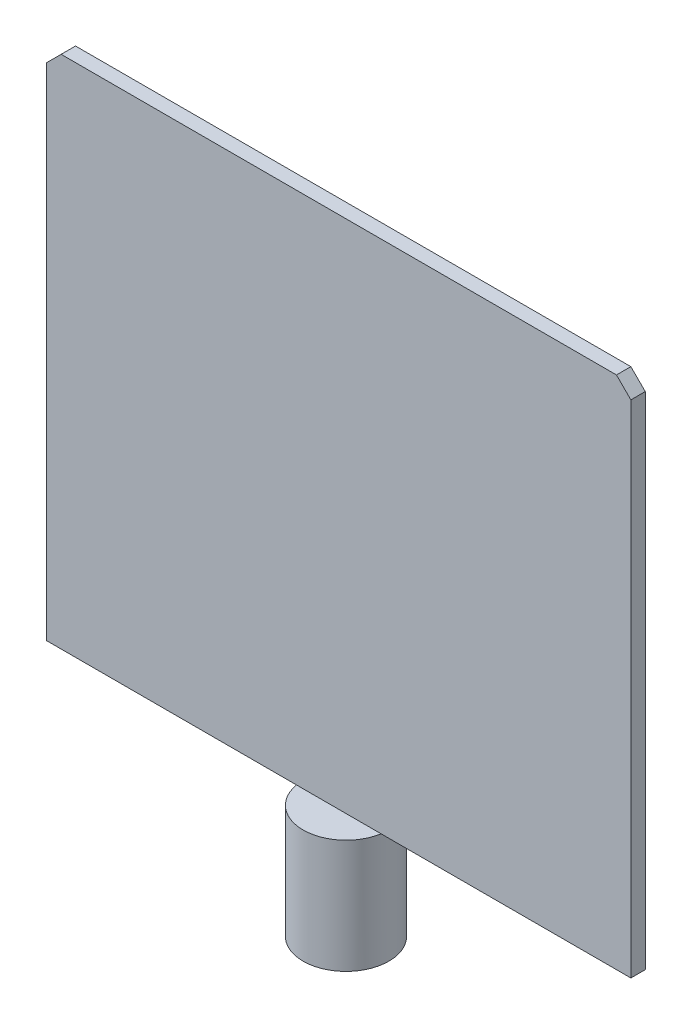
ISO-10303-21;
HEADER;
FILE_DESCRIPTION(('STEP AP214'),'2;1');
FILE_NAME('part.step','',(''),(''),'','','');
FILE_SCHEMA(('AUTOMOTIVE_DESIGN { 1 0 10303 214 1 1 1 1 }'));
ENDSEC;
DATA;
#1=APPLICATION_CONTEXT('core data for automotive mechanical design processes');
#2=APPLICATION_PROTOCOL_DEFINITION('international standard','automotive_design',2000,#1);
#3=PRODUCT_CONTEXT('',#1,'mechanical');
#4=PRODUCT('Part','Part','',(#3));
#5=PRODUCT_RELATED_PRODUCT_CATEGORY('part','',(#4));
#6=PRODUCT_DEFINITION_FORMATION('','',#4);
#7=PRODUCT_DEFINITION_CONTEXT('part definition',#1,'design');
#8=PRODUCT_DEFINITION('design','',#6,#7);
#9=PRODUCT_DEFINITION_SHAPE('','',#8);
#10=(LENGTH_UNIT() NAMED_UNIT(*) SI_UNIT(.MILLI.,.METRE.));
#11=(NAMED_UNIT(*) PLANE_ANGLE_UNIT() SI_UNIT($,.RADIAN.));
#12=(NAMED_UNIT(*) SI_UNIT($,.STERADIAN.) SOLID_ANGLE_UNIT());
#13=UNCERTAINTY_MEASURE_WITH_UNIT(LENGTH_MEASURE(1.E-05),#10,'distance_accuracy_value','');
#14=(GEOMETRIC_REPRESENTATION_CONTEXT(3) GLOBAL_UNCERTAINTY_ASSIGNED_CONTEXT((#13)) GLOBAL_UNIT_ASSIGNED_CONTEXT((#10,
#11,#12)) REPRESENTATION_CONTEXT('',''));
#15=CARTESIAN_POINT('',(0.,0.,0.));
#16=DIRECTION('',(0.,0.,1.));
#17=DIRECTION('',(1.,0.,0.));
#18=AXIS2_PLACEMENT_3D('',#15,#16,#17);
#19=CARTESIAN_POINT('',(0.,0.,0.));
#20=DIRECTION('',(0.,1.,0.));
#21=DIRECTION('',(0.,0.,1.));
#22=AXIS2_PLACEMENT_3D('',#19,#20,#21);
#23=PLANE('',#22);
#24=CARTESIAN_POINT('',(0.,0.,0.));
#25=DIRECTION('',(0.,1.,0.));
#26=DIRECTION('',(0.,0.,1.));
#27=AXIS2_PLACEMENT_3D('',#24,#25,#26);
#28=CIRCLE('',#27,2.98);
#29=CARTESIAN_POINT('',(2.93775424431657,0.,-0.5));
#30=VERTEX_POINT('',#29);
#31=CARTESIAN_POINT('',(-2.93775424431657,0.,-0.5));
#32=VERTEX_POINT('',#31);
#33=EDGE_CURVE('E200',#30,#32,#28,.T.);
#34=ORIENTED_EDGE('',*,*,#33,.T.);
#35=DIRECTION('',(1.,0.,0.));
#36=VECTOR('',#35,1.);
#37=CARTESIAN_POINT('',(-20.3,0.,-0.5));
#38=LINE('',#37,#36);
#39=EDGE_CURVE('E147',#32,#30,#38,.T.);
#40=ORIENTED_EDGE('',*,*,#39,.T.);
#41=EDGE_LOOP('',(#34,#40));
#42=FACE_BOUND('',#41,.T.);
#43=ADVANCED_FACE('F41',(#42),#23,.T.);
#44=CARTESIAN_POINT('',(0.,-7.9,0.));
#45=DIRECTION('',(0.,1.,0.));
#46=DIRECTION('',(0.,0.,1.));
#47=AXIS2_PLACEMENT_3D('',#44,#45,#46);
#48=CYLINDRICAL_SURFACE('',#47,2.98);
#49=CARTESIAN_POINT('',(0.,-7.9,0.));
#50=DIRECTION('',(0.,1.,0.));
#51=DIRECTION('',(0.,0.,1.));
#52=AXIS2_PLACEMENT_3D('',#49,#50,#51);
#53=CIRCLE('',#52,2.98);
#54=CARTESIAN_POINT('',(0.,-7.9,2.98));
#55=VERTEX_POINT('',#54);
#56=EDGE_CURVE('E154',#55,#55,#53,.T.);
#57=ORIENTED_EDGE('',*,*,#56,.T.);
#58=EDGE_LOOP('',(#57));
#59=FACE_BOUND('',#58,.T.);
#60=CARTESIAN_POINT('',(2.93775424431657,0.,0.5));
#61=VERTEX_POINT('',#60);
#62=EDGE_CURVE('E163',#61,#30,#28,.T.);
#63=ORIENTED_EDGE('',*,*,#62,.F.);
#64=CARTESIAN_POINT('',(-2.93775424431657,0.,0.5));
#65=VERTEX_POINT('',#64);
#66=EDGE_CURVE('E201',#65,#61,#28,.T.);
#67=ORIENTED_EDGE('',*,*,#66,.F.);
#68=EDGE_CURVE('E135',#32,#65,#28,.T.);
#69=ORIENTED_EDGE('',*,*,#68,.F.);
#70=ORIENTED_EDGE('',*,*,#33,.F.);
#71=EDGE_LOOP('',(#63,#67,#69,#70));
#72=FACE_BOUND('',#71,.T.);
#73=ADVANCED_FACE('F215',(#59,#72),#48,.T.);
#74=CARTESIAN_POINT('',(0.,-7.9,0.));
#75=DIRECTION('',(0.,1.,0.));
#76=DIRECTION('',(0.,0.,1.));
#77=AXIS2_PLACEMENT_3D('',#74,#75,#76);
#78=PLANE('',#77);
#79=ORIENTED_EDGE('',*,*,#56,.F.);
#80=EDGE_LOOP('',(#79));
#81=FACE_BOUND('',#80,.T.);
#82=ADVANCED_FACE('F222',(#81),#78,.F.);
#83=DIRECTION('',(1.,0.,0.));
#84=VECTOR('',#83,1.);
#85=CARTESIAN_POINT('',(-20.3,0.,0.5));
#86=LINE('',#85,#84);
#87=EDGE_CURVE('E139',#65,#61,#86,.T.);
#88=ORIENTED_EDGE('',*,*,#87,.F.);
#89=ORIENTED_EDGE('',*,*,#66,.T.);
#90=EDGE_LOOP('',(#88,#89));
#91=FACE_BOUND('',#90,.T.);
#92=ADVANCED_FACE('F220',(#91),#23,.T.);
#93=CARTESIAN_POINT('',(-20.3,0.,-0.5));
#94=DIRECTION('',(0.,-1.,0.));
#95=DIRECTION('',(0.,0.,-1.));
#96=AXIS2_PLACEMENT_3D('',#93,#94,#95);
#97=PLANE('',#96);
#98=CARTESIAN_POINT('',(20.3,0.,0.5));
#99=VERTEX_POINT('',#98);
#100=EDGE_CURVE('E120',#61,#99,#86,.T.);
#101=ORIENTED_EDGE('',*,*,#100,.F.);
#102=ORIENTED_EDGE('',*,*,#62,.T.);
#103=CARTESIAN_POINT('',(20.3,0.,-0.5));
#104=VERTEX_POINT('',#103);
#105=EDGE_CURVE('E157',#30,#104,#38,.T.);
#106=ORIENTED_EDGE('',*,*,#105,.T.);
#107=DIRECTION('',(0.,0.,1.));
#108=VECTOR('',#107,1.);
#109=CARTESIAN_POINT('',(20.3,0.,-0.5));
#110=LINE('',#109,#108);
#111=EDGE_CURVE('E130',#104,#99,#110,.T.);
#112=ORIENTED_EDGE('',*,*,#111,.T.);
#113=EDGE_LOOP('',(#101,#102,#106,#112));
#114=FACE_BOUND('',#113,.T.);
#115=ADVANCED_FACE('F212',(#114),#97,.T.);
#116=CARTESIAN_POINT('',(-20.3,35.8,-0.5));
#117=DIRECTION('',(-1.,0.,0.));
#118=DIRECTION('',(0.,-1.,0.));
#119=AXIS2_PLACEMENT_3D('',#116,#117,#118);
#120=PLANE('',#119);
#121=DIRECTION('',(0.,-1.,0.));
#122=VECTOR('',#121,1.);
#123=CARTESIAN_POINT('',(-20.3,35.8,0.5));
#124=LINE('',#123,#122);
#125=CARTESIAN_POINT('',(-20.3,34.8,0.5));
#126=VERTEX_POINT('',#125);
#127=CARTESIAN_POINT('',(-20.3,0.,0.5));
#128=VERTEX_POINT('',#127);
#129=EDGE_CURVE('E110',#126,#128,#124,.T.);
#130=ORIENTED_EDGE('',*,*,#129,.F.);
#131=DIRECTION('',(0.,0.,-1.));
#132=VECTOR('',#131,1.);
#133=CARTESIAN_POINT('',(-20.3,34.8,-0.5));
#134=LINE('',#133,#132);
#135=CARTESIAN_POINT('',(-20.3,34.8,-0.5));
#136=VERTEX_POINT('',#135);
#137=EDGE_CURVE('E66',#126,#136,#134,.T.);
#138=ORIENTED_EDGE('',*,*,#137,.T.);
#139=DIRECTION('',(0.,-1.,0.));
#140=VECTOR('',#139,1.);
#141=CARTESIAN_POINT('',(-20.3,35.8,-0.5));
#142=LINE('',#141,#140);
#143=CARTESIAN_POINT('',(-20.3,0.,-0.5));
#144=VERTEX_POINT('',#143);
#145=EDGE_CURVE('E125',#136,#144,#142,.T.);
#146=ORIENTED_EDGE('',*,*,#145,.T.);
#147=DIRECTION('',(0.,0.,1.));
#148=VECTOR('',#147,1.);
#149=CARTESIAN_POINT('',(-20.3,0.,-0.5));
#150=LINE('',#149,#148);
#151=EDGE_CURVE('E123',#144,#128,#150,.T.);
#152=ORIENTED_EDGE('',*,*,#151,.T.);
#153=EDGE_LOOP('',(#130,#138,#146,#152));
#154=FACE_BOUND('',#153,.T.);
#155=ADVANCED_FACE('F124',(#154),#120,.T.);
#156=CARTESIAN_POINT('',(-20.3,35.8,-0.5));
#157=DIRECTION('',(0.,1.,0.));
#158=DIRECTION('',(0.,0.,1.));
#159=AXIS2_PLACEMENT_3D('',#156,#157,#158);
#160=PLANE('',#159);
#161=DIRECTION('',(-1.,0.,0.));
#162=VECTOR('',#161,1.);
#163=CARTESIAN_POINT('',(-20.3,35.8,-0.5));
#164=LINE('',#163,#162);
#165=CARTESIAN_POINT('',(19.3,35.8,-0.5));
#166=VERTEX_POINT('',#165);
#167=CARTESIAN_POINT('',(-19.3,35.8,-0.5));
#168=VERTEX_POINT('',#167);
#169=EDGE_CURVE('E131',#166,#168,#164,.T.);
#170=ORIENTED_EDGE('',*,*,#169,.T.);
#171=DIRECTION('',(0.,0.,1.));
#172=VECTOR('',#171,1.);
#173=CARTESIAN_POINT('',(-19.3,35.8,-0.5));
#174=LINE('',#173,#172);
#175=CARTESIAN_POINT('',(-19.3,35.8,0.5));
#176=VERTEX_POINT('',#175);
#177=EDGE_CURVE('E151',#168,#176,#174,.T.);
#178=ORIENTED_EDGE('',*,*,#177,.T.);
#179=DIRECTION('',(-1.,0.,0.));
#180=VECTOR('',#179,1.);
#181=CARTESIAN_POINT('',(-20.3,35.8,0.5));
#182=LINE('',#181,#180);
#183=CARTESIAN_POINT('',(19.3,35.8,0.5));
#184=VERTEX_POINT('',#183);
#185=EDGE_CURVE('E143',#184,#176,#182,.T.);
#186=ORIENTED_EDGE('',*,*,#185,.F.);
#187=DIRECTION('',(0.,0.,-1.));
#188=VECTOR('',#187,1.);
#189=CARTESIAN_POINT('',(19.3,35.8,-0.5));
#190=LINE('',#189,#188);
#191=EDGE_CURVE('E146',#184,#166,#190,.T.);
#192=ORIENTED_EDGE('',*,*,#191,.T.);
#193=EDGE_LOOP('',(#170,#178,#186,#192));
#194=FACE_BOUND('',#193,.T.);
#195=ADVANCED_FACE('F183',(#194),#160,.T.);
#196=CARTESIAN_POINT('',(20.3,35.8,-0.5));
#197=DIRECTION('',(1.,0.,0.));
#198=DIRECTION('',(0.,1.,0.));
#199=AXIS2_PLACEMENT_3D('',#196,#197,#198);
#200=PLANE('',#199);
#201=DIRECTION('',(0.,1.,0.));
#202=VECTOR('',#201,1.);
#203=CARTESIAN_POINT('',(20.3,35.8,-0.5));
#204=LINE('',#203,#202);
#205=CARTESIAN_POINT('',(20.3,34.8,-0.5));
#206=VERTEX_POINT('',#205);
#207=EDGE_CURVE('E168',#104,#206,#204,.T.);
#208=ORIENTED_EDGE('',*,*,#207,.T.);
#209=DIRECTION('',(0.,0.,1.));
#210=VECTOR('',#209,1.);
#211=CARTESIAN_POINT('',(20.3,34.8,-0.5));
#212=LINE('',#211,#210);
#213=CARTESIAN_POINT('',(20.3,34.8,0.5));
#214=VERTEX_POINT('',#213);
#215=EDGE_CURVE('E11',#206,#214,#212,.T.);
#216=ORIENTED_EDGE('',*,*,#215,.T.);
#217=DIRECTION('',(0.,1.,0.));
#218=VECTOR('',#217,1.);
#219=CARTESIAN_POINT('',(20.3,35.8,0.5));
#220=LINE('',#219,#218);
#221=EDGE_CURVE('E137',#99,#214,#220,.T.);
#222=ORIENTED_EDGE('',*,*,#221,.F.);
#223=ORIENTED_EDGE('',*,*,#111,.F.);
#224=EDGE_LOOP('',(#208,#216,#222,#223));
#225=FACE_BOUND('',#224,.T.);
#226=ADVANCED_FACE('F208',(#225),#200,.T.);
#227=EDGE_CURVE('E156',#144,#32,#38,.T.);
#228=ORIENTED_EDGE('',*,*,#227,.T.);
#229=ORIENTED_EDGE('',*,*,#68,.T.);
#230=EDGE_CURVE('E116',#128,#65,#86,.T.);
#231=ORIENTED_EDGE('',*,*,#230,.F.);
#232=ORIENTED_EDGE('',*,*,#151,.F.);
#233=EDGE_LOOP('',(#228,#229,#231,#232));
#234=FACE_BOUND('',#233,.T.);
#235=ADVANCED_FACE('F133',(#234),#97,.T.);
#236=CARTESIAN_POINT('',(0.,0.,-0.5));
#237=DIRECTION('',(0.,0.,1.));
#238=DIRECTION('',(1.,0.,0.));
#239=AXIS2_PLACEMENT_3D('',#236,#237,#238);
#240=PLANE('',#239);
#241=ORIENTED_EDGE('',*,*,#145,.F.);
#242=DIRECTION('',(-0.707106781186545,-0.70710678118655,0.));
#243=VECTOR('',#242,1.);
#244=CARTESIAN_POINT('',(-19.3,35.8,-0.5));
#245=LINE('',#244,#243);
#246=EDGE_CURVE('E51',#136,#168,#245,.F.);
#247=ORIENTED_EDGE('',*,*,#246,.T.);
#248=ORIENTED_EDGE('',*,*,#169,.F.);
#249=DIRECTION('',(-0.707106781186552,0.707106781186543,0.));
#250=VECTOR('',#249,1.);
#251=CARTESIAN_POINT('',(20.3,34.8,-0.5));
#252=LINE('',#251,#250);
#253=EDGE_CURVE('E58',#166,#206,#252,.F.);
#254=ORIENTED_EDGE('',*,*,#253,.T.);
#255=ORIENTED_EDGE('',*,*,#207,.F.);
#256=ORIENTED_EDGE('',*,*,#105,.F.);
#257=ORIENTED_EDGE('',*,*,#39,.F.);
#258=ORIENTED_EDGE('',*,*,#227,.F.);
#259=EDGE_LOOP('',(#241,#247,#248,#254,#255,#256,#257,#258));
#260=FACE_BOUND('',#259,.T.);
#261=ADVANCED_FACE('F210',(#260),#240,.F.);
#262=CARTESIAN_POINT('',(0.,0.,0.5));
#263=DIRECTION('',(0.,0.,1.));
#264=DIRECTION('',(1.,0.,0.));
#265=AXIS2_PLACEMENT_3D('',#262,#263,#264);
#266=PLANE('',#265);
#267=ORIENTED_EDGE('',*,*,#185,.T.);
#268=DIRECTION('',(0.707106781186545,0.70710678118655,0.));
#269=VECTOR('',#268,1.);
#270=CARTESIAN_POINT('',(-27.5500000000001,27.5499999999999,0.5));
#271=LINE('',#270,#269);
#272=EDGE_CURVE('E118',#176,#126,#271,.F.);
#273=ORIENTED_EDGE('',*,*,#272,.T.);
#274=ORIENTED_EDGE('',*,*,#129,.T.);
#275=ORIENTED_EDGE('',*,*,#230,.T.);
#276=ORIENTED_EDGE('',*,*,#87,.T.);
#277=ORIENTED_EDGE('',*,*,#100,.T.);
#278=ORIENTED_EDGE('',*,*,#221,.T.);
#279=DIRECTION('',(0.707106781186552,-0.707106781186543,0.));
#280=VECTOR('',#279,1.);
#281=CARTESIAN_POINT('',(27.5499999999999,27.5500000000002,0.5));
#282=LINE('',#281,#280);
#283=EDGE_CURVE('E178',#214,#184,#282,.F.);
#284=ORIENTED_EDGE('',*,*,#283,.T.);
#285=EDGE_LOOP('',(#267,#273,#274,#275,#276,#277,#278,#284));
#286=FACE_BOUND('',#285,.T.);
#287=ADVANCED_FACE('F113',(#286),#266,.T.);
#288=CARTESIAN_POINT('',(-19.3,35.8,-0.5));
#289=DIRECTION('',(0.70710678118655,-0.707106781186545,0.));
#290=DIRECTION('',(0.,0.,1.));
#291=AXIS2_PLACEMENT_3D('',#288,#289,#290);
#292=PLANE('',#291);
#293=ORIENTED_EDGE('',*,*,#246,.F.);
#294=ORIENTED_EDGE('',*,*,#137,.F.);
#295=ORIENTED_EDGE('',*,*,#272,.F.);
#296=ORIENTED_EDGE('',*,*,#177,.F.);
#297=EDGE_LOOP('',(#293,#294,#295,#296));
#298=FACE_BOUND('',#297,.T.);
#299=ADVANCED_FACE('F240',(#298),#292,.F.);
#300=CARTESIAN_POINT('',(20.3,34.8,-0.5));
#301=DIRECTION('',(-0.707106781186543,-0.707106781186552,0.));
#302=DIRECTION('',(0.,0.,1.));
#303=AXIS2_PLACEMENT_3D('',#300,#301,#302);
#304=PLANE('',#303);
#305=ORIENTED_EDGE('',*,*,#253,.F.);
#306=ORIENTED_EDGE('',*,*,#191,.F.);
#307=ORIENTED_EDGE('',*,*,#283,.F.);
#308=ORIENTED_EDGE('',*,*,#215,.F.);
#309=EDGE_LOOP('',(#305,#306,#307,#308));
#310=FACE_BOUND('',#309,.T.);
#311=ADVANCED_FACE('F44',(#310),#304,.F.);
#312=CLOSED_SHELL('',(#43,#73,#82,#92,#115,#155,#195,#226,#235,#261,#287,#299,#311));
#313=MANIFOLD_SOLID_BREP('B2',#312);
#314=ADVANCED_BREP_SHAPE_REPRESENTATION('',(#18,#313),#14);
#315=SHAPE_DEFINITION_REPRESENTATION(#9,#314);
ENDSEC;
END-ISO-10303-21;
